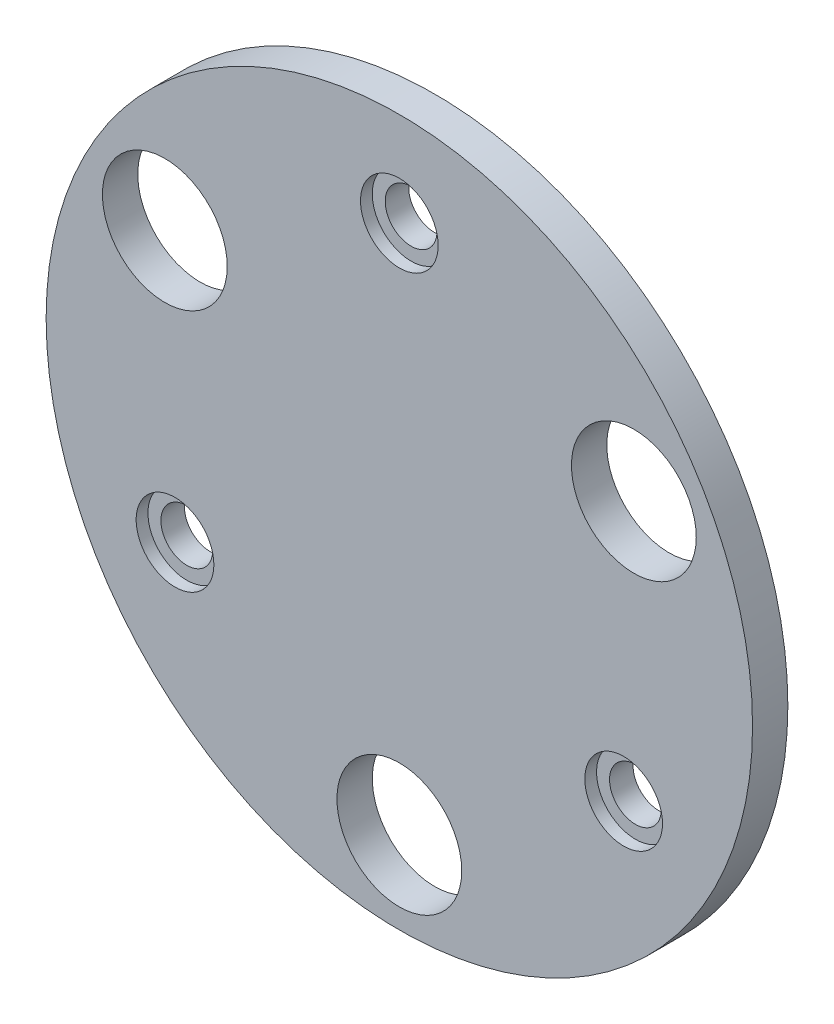
ISO-10303-21;
HEADER;
FILE_DESCRIPTION(('STEP AP214'),'2;1');
FILE_NAME('part.step','',(''),(''),'','','');
FILE_SCHEMA(('AUTOMOTIVE_DESIGN { 1 0 10303 214 1 1 1 1 }'));
ENDSEC;
DATA;
#1=APPLICATION_CONTEXT('core data for automotive mechanical design processes');
#2=APPLICATION_PROTOCOL_DEFINITION('international standard','automotive_design',2000,#1);
#3=PRODUCT_CONTEXT('',#1,'mechanical');
#4=PRODUCT('Part','Part','',(#3));
#5=PRODUCT_RELATED_PRODUCT_CATEGORY('part','',(#4));
#6=PRODUCT_DEFINITION_FORMATION('','',#4);
#7=PRODUCT_DEFINITION_CONTEXT('part definition',#1,'design');
#8=PRODUCT_DEFINITION('design','',#6,#7);
#9=PRODUCT_DEFINITION_SHAPE('','',#8);
#10=(LENGTH_UNIT() NAMED_UNIT(*) SI_UNIT(.MILLI.,.METRE.));
#11=(NAMED_UNIT(*) PLANE_ANGLE_UNIT() SI_UNIT($,.RADIAN.));
#12=(NAMED_UNIT(*) SI_UNIT($,.STERADIAN.) SOLID_ANGLE_UNIT());
#13=UNCERTAINTY_MEASURE_WITH_UNIT(LENGTH_MEASURE(1.E-05),#10,'distance_accuracy_value','');
#14=(GEOMETRIC_REPRESENTATION_CONTEXT(3) GLOBAL_UNCERTAINTY_ASSIGNED_CONTEXT((#13)) GLOBAL_UNIT_ASSIGNED_CONTEXT((#10,
#11,#12)) REPRESENTATION_CONTEXT('',''));
#15=CARTESIAN_POINT('',(0.,0.,0.));
#16=DIRECTION('',(0.,0.,1.));
#17=DIRECTION('',(1.,0.,0.));
#18=AXIS2_PLACEMENT_3D('',#15,#16,#17);
#19=CARTESIAN_POINT('',(0.,11.,1.5));
#20=DIRECTION('',(0.,0.,-1.));
#21=DIRECTION('',(-1.,0.,0.));
#22=AXIS2_PLACEMENT_3D('',#19,#20,#21);
#23=CYLINDRICAL_SURFACE('',#22,1.1);
#24=CARTESIAN_POINT('',(0.,11.,0.));
#25=DIRECTION('',(0.,0.,1.));
#26=DIRECTION('',(1.,0.,0.));
#27=AXIS2_PLACEMENT_3D('',#24,#25,#26);
#28=CIRCLE('',#27,1.1);
#29=CARTESIAN_POINT('',(1.1,11.,0.));
#30=VERTEX_POINT('',#29);
#31=EDGE_CURVE('E96',#30,#30,#28,.T.);
#32=ORIENTED_EDGE('',*,*,#31,.F.);
#33=EDGE_LOOP('',(#32));
#34=FACE_BOUND('',#33,.T.);
#35=CARTESIAN_POINT('',(0.,11.,1.));
#36=DIRECTION('',(0.,0.,1.));
#37=DIRECTION('',(1.,0.,0.));
#38=AXIS2_PLACEMENT_3D('',#35,#36,#37);
#39=CIRCLE('',#38,1.1);
#40=CARTESIAN_POINT('',(1.1,11.,1.));
#41=VERTEX_POINT('',#40);
#42=EDGE_CURVE('E122',#41,#41,#39,.T.);
#43=ORIENTED_EDGE('',*,*,#42,.T.);
#44=EDGE_LOOP('',(#43));
#45=FACE_BOUND('',#44,.T.);
#46=ADVANCED_FACE('F57',(#34,#45),#23,.F.);
#47=CARTESIAN_POINT('',(-9.52627944162883,-5.5,1.5));
#48=DIRECTION('',(0.,0.,-1.));
#49=DIRECTION('',(-1.,0.,0.));
#50=AXIS2_PLACEMENT_3D('',#47,#48,#49);
#51=CYLINDRICAL_SURFACE('',#50,1.1);
#52=CARTESIAN_POINT('',(-9.52627944162883,-5.5,0.));
#53=DIRECTION('',(0.,0.,1.));
#54=DIRECTION('',(1.,0.,0.));
#55=AXIS2_PLACEMENT_3D('',#52,#53,#54);
#56=CIRCLE('',#55,1.1);
#57=CARTESIAN_POINT('',(-8.42627944162883,-5.5,0.));
#58=VERTEX_POINT('',#57);
#59=EDGE_CURVE('E76',#58,#58,#56,.T.);
#60=ORIENTED_EDGE('',*,*,#59,.F.);
#61=EDGE_LOOP('',(#60));
#62=FACE_BOUND('',#61,.T.);
#63=CARTESIAN_POINT('',(-9.52627944162883,-5.5,1.));
#64=DIRECTION('',(0.,0.,1.));
#65=DIRECTION('',(1.,0.,0.));
#66=AXIS2_PLACEMENT_3D('',#63,#64,#65);
#67=CIRCLE('',#66,1.1);
#68=CARTESIAN_POINT('',(-8.42627944162883,-5.5,1.));
#69=VERTEX_POINT('',#68);
#70=EDGE_CURVE('E126',#69,#69,#67,.T.);
#71=ORIENTED_EDGE('',*,*,#70,.T.);
#72=EDGE_LOOP('',(#71));
#73=FACE_BOUND('',#72,.T.);
#74=ADVANCED_FACE('F59',(#62,#73),#51,.F.);
#75=CARTESIAN_POINT('',(9.52627944162883,-5.5,1.5));
#76=DIRECTION('',(0.,0.,-1.));
#77=DIRECTION('',(-1.,0.,0.));
#78=AXIS2_PLACEMENT_3D('',#75,#76,#77);
#79=CYLINDRICAL_SURFACE('',#78,1.1);
#80=CARTESIAN_POINT('',(9.52627944162883,-5.5,0.));
#81=DIRECTION('',(0.,0.,1.));
#82=DIRECTION('',(1.,0.,0.));
#83=AXIS2_PLACEMENT_3D('',#80,#81,#82);
#84=CIRCLE('',#83,1.1);
#85=CARTESIAN_POINT('',(10.6262794416288,-5.5,0.));
#86=VERTEX_POINT('',#85);
#87=EDGE_CURVE('E99',#86,#86,#84,.T.);
#88=ORIENTED_EDGE('',*,*,#87,.F.);
#89=EDGE_LOOP('',(#88));
#90=FACE_BOUND('',#89,.T.);
#91=CARTESIAN_POINT('',(9.52627944162883,-5.5,1.));
#92=DIRECTION('',(0.,0.,1.));
#93=DIRECTION('',(1.,0.,0.));
#94=AXIS2_PLACEMENT_3D('',#91,#92,#93);
#95=CIRCLE('',#94,1.1);
#96=CARTESIAN_POINT('',(10.6262794416288,-5.5,1.));
#97=VERTEX_POINT('',#96);
#98=EDGE_CURVE('E61',#97,#97,#95,.T.);
#99=ORIENTED_EDGE('',*,*,#98,.T.);
#100=EDGE_LOOP('',(#99));
#101=FACE_BOUND('',#100,.T.);
#102=ADVANCED_FACE('F216',(#90,#101),#79,.F.);
#103=CARTESIAN_POINT('',(0.,0.,1.5));
#104=DIRECTION('',(0.,0.,-1.));
#105=DIRECTION('',(-1.,0.,0.));
#106=AXIS2_PLACEMENT_3D('',#103,#104,#105);
#107=CYLINDRICAL_SURFACE('',#106,15.);
#108=CARTESIAN_POINT('',(0.,0.,1.5));
#109=DIRECTION('',(0.,0.,1.));
#110=DIRECTION('',(1.,0.,0.));
#111=AXIS2_PLACEMENT_3D('',#108,#109,#110);
#112=CIRCLE('',#111,15.);
#113=CARTESIAN_POINT('',(15.,0.,1.5));
#114=VERTEX_POINT('',#113);
#115=EDGE_CURVE('E11',#114,#114,#112,.T.);
#116=ORIENTED_EDGE('',*,*,#115,.F.);
#117=EDGE_LOOP('',(#116));
#118=FACE_BOUND('',#117,.T.);
#119=CARTESIAN_POINT('',(0.,0.,0.));
#120=DIRECTION('',(0.,0.,1.));
#121=DIRECTION('',(1.,0.,0.));
#122=AXIS2_PLACEMENT_3D('',#119,#120,#121);
#123=CIRCLE('',#122,15.);
#124=CARTESIAN_POINT('',(15.,0.,0.));
#125=VERTEX_POINT('',#124);
#126=EDGE_CURVE('E92',#125,#125,#123,.T.);
#127=ORIENTED_EDGE('',*,*,#126,.T.);
#128=EDGE_LOOP('',(#127));
#129=FACE_BOUND('',#128,.T.);
#130=ADVANCED_FACE('F179',(#118,#129),#107,.T.);
#131=CARTESIAN_POINT('',(9.95929214352106,5.74999999999998,1.5));
#132=DIRECTION('',(0.,0.,-1.));
#133=DIRECTION('',(-1.,0.,0.));
#134=AXIS2_PLACEMENT_3D('',#131,#132,#133);
#135=CYLINDRICAL_SURFACE('',#134,2.65);
#136=CARTESIAN_POINT('',(9.95929214352106,5.74999999999998,1.5));
#137=DIRECTION('',(0.,0.,1.));
#138=DIRECTION('',(1.,0.,0.));
#139=AXIS2_PLACEMENT_3D('',#136,#137,#138);
#140=CIRCLE('',#139,2.65);
#141=CARTESIAN_POINT('',(12.6092921435211,5.74999999999998,1.5));
#142=VERTEX_POINT('',#141);
#143=EDGE_CURVE('E66',#142,#142,#140,.T.);
#144=ORIENTED_EDGE('',*,*,#143,.T.);
#145=EDGE_LOOP('',(#144));
#146=FACE_BOUND('',#145,.T.);
#147=CARTESIAN_POINT('',(9.95929214352106,5.74999999999998,0.));
#148=DIRECTION('',(0.,0.,1.));
#149=DIRECTION('',(1.,0.,0.));
#150=AXIS2_PLACEMENT_3D('',#147,#148,#149);
#151=CIRCLE('',#150,2.65);
#152=CARTESIAN_POINT('',(12.6092921435211,5.74999999999998,0.));
#153=VERTEX_POINT('',#152);
#154=EDGE_CURVE('E88',#153,#153,#151,.T.);
#155=ORIENTED_EDGE('',*,*,#154,.F.);
#156=EDGE_LOOP('',(#155));
#157=FACE_BOUND('',#156,.T.);
#158=ADVANCED_FACE('F175',(#146,#157),#135,.F.);
#159=CARTESIAN_POINT('',(0.,-11.5,1.5));
#160=DIRECTION('',(0.,0.,-1.));
#161=DIRECTION('',(-1.,0.,0.));
#162=AXIS2_PLACEMENT_3D('',#159,#160,#161);
#163=CYLINDRICAL_SURFACE('',#162,2.65);
#164=CARTESIAN_POINT('',(0.,-11.5,1.5));
#165=DIRECTION('',(0.,0.,1.));
#166=DIRECTION('',(1.,0.,0.));
#167=AXIS2_PLACEMENT_3D('',#164,#165,#166);
#168=CIRCLE('',#167,2.65);
#169=CARTESIAN_POINT('',(2.64999999999998,-11.5,1.5));
#170=VERTEX_POINT('',#169);
#171=EDGE_CURVE('E72',#170,#170,#168,.T.);
#172=ORIENTED_EDGE('',*,*,#171,.T.);
#173=EDGE_LOOP('',(#172));
#174=FACE_BOUND('',#173,.T.);
#175=CARTESIAN_POINT('',(0.,-11.5,0.));
#176=DIRECTION('',(0.,0.,1.));
#177=DIRECTION('',(1.,0.,0.));
#178=AXIS2_PLACEMENT_3D('',#175,#176,#177);
#179=CIRCLE('',#178,2.65);
#180=CARTESIAN_POINT('',(2.64999999999998,-11.5,0.));
#181=VERTEX_POINT('',#180);
#182=EDGE_CURVE('E84',#181,#181,#179,.T.);
#183=ORIENTED_EDGE('',*,*,#182,.F.);
#184=EDGE_LOOP('',(#183));
#185=FACE_BOUND('',#184,.T.);
#186=ADVANCED_FACE('F178',(#174,#185),#163,.F.);
#187=CARTESIAN_POINT('',(-9.95929214352103,5.75000000000002,1.5));
#188=DIRECTION('',(0.,0.,-1.));
#189=DIRECTION('',(-1.,0.,0.));
#190=AXIS2_PLACEMENT_3D('',#187,#188,#189);
#191=CYLINDRICAL_SURFACE('',#190,2.65);
#192=CARTESIAN_POINT('',(-9.95929214352103,5.75000000000002,1.5));
#193=DIRECTION('',(0.,0.,1.));
#194=DIRECTION('',(1.,0.,0.));
#195=AXIS2_PLACEMENT_3D('',#192,#193,#194);
#196=CIRCLE('',#195,2.65);
#197=CARTESIAN_POINT('',(-7.30929214352103,5.75000000000002,1.5));
#198=VERTEX_POINT('',#197);
#199=EDGE_CURVE('E102',#198,#198,#196,.T.);
#200=ORIENTED_EDGE('',*,*,#199,.T.);
#201=EDGE_LOOP('',(#200));
#202=FACE_BOUND('',#201,.T.);
#203=CARTESIAN_POINT('',(-9.95929214352103,5.75000000000002,0.));
#204=DIRECTION('',(0.,0.,1.));
#205=DIRECTION('',(1.,0.,0.));
#206=AXIS2_PLACEMENT_3D('',#203,#204,#205);
#207=CIRCLE('',#206,2.65);
#208=CARTESIAN_POINT('',(-7.30929214352103,5.75000000000002,0.));
#209=VERTEX_POINT('',#208);
#210=EDGE_CURVE('E80',#209,#209,#207,.T.);
#211=ORIENTED_EDGE('',*,*,#210,.F.);
#212=EDGE_LOOP('',(#211));
#213=FACE_BOUND('',#212,.T.);
#214=ADVANCED_FACE('F164',(#202,#213),#191,.F.);
#215=CARTESIAN_POINT('',(0.,0.,1.5));
#216=DIRECTION('',(0.,0.,1.));
#217=DIRECTION('',(1.,0.,0.));
#218=AXIS2_PLACEMENT_3D('',#215,#216,#217);
#219=PLANE('',#218);
#220=CARTESIAN_POINT('',(-9.52627944162883,-5.5,1.5));
#221=DIRECTION('',(0.,0.,1.));
#222=DIRECTION('',(1.,0.,0.));
#223=AXIS2_PLACEMENT_3D('',#220,#221,#222);
#224=CIRCLE('',#223,1.65000000000009);
#225=CARTESIAN_POINT('',(-7.87627944162873,-5.5,1.5));
#226=VERTEX_POINT('',#225);
#227=EDGE_CURVE('E134',#226,#226,#224,.T.);
#228=ORIENTED_EDGE('',*,*,#227,.F.);
#229=EDGE_LOOP('',(#228));
#230=FACE_BOUND('',#229,.T.);
#231=CARTESIAN_POINT('',(0.,11.,1.5));
#232=DIRECTION('',(0.,0.,1.));
#233=DIRECTION('',(1.,0.,0.));
#234=AXIS2_PLACEMENT_3D('',#231,#232,#233);
#235=CIRCLE('',#234,1.65);
#236=CARTESIAN_POINT('',(1.65,11.,1.5));
#237=VERTEX_POINT('',#236);
#238=EDGE_CURVE('E127',#237,#237,#235,.T.);
#239=ORIENTED_EDGE('',*,*,#238,.F.);
#240=EDGE_LOOP('',(#239));
#241=FACE_BOUND('',#240,.T.);
#242=CARTESIAN_POINT('',(9.52627944162883,-5.5,1.5));
#243=DIRECTION('',(0.,0.,1.));
#244=DIRECTION('',(1.,0.,0.));
#245=AXIS2_PLACEMENT_3D('',#242,#243,#244);
#246=CIRCLE('',#245,1.65000000000005);
#247=CARTESIAN_POINT('',(11.1762794416289,-5.5,1.5));
#248=VERTEX_POINT('',#247);
#249=EDGE_CURVE('E117',#248,#248,#246,.T.);
#250=ORIENTED_EDGE('',*,*,#249,.F.);
#251=EDGE_LOOP('',(#250));
#252=FACE_BOUND('',#251,.T.);
#253=ORIENTED_EDGE('',*,*,#199,.F.);
#254=EDGE_LOOP('',(#253));
#255=FACE_BOUND('',#254,.T.);
#256=ORIENTED_EDGE('',*,*,#171,.F.);
#257=EDGE_LOOP('',(#256));
#258=FACE_BOUND('',#257,.T.);
#259=ORIENTED_EDGE('',*,*,#143,.F.);
#260=EDGE_LOOP('',(#259));
#261=FACE_BOUND('',#260,.T.);
#262=ORIENTED_EDGE('',*,*,#115,.T.);
#263=EDGE_LOOP('',(#262));
#264=FACE_BOUND('',#263,.T.);
#265=ADVANCED_FACE('F160',(#230,#241,#252,#255,#258,#261,#264),#219,.T.);
#266=CARTESIAN_POINT('',(0.,0.,0.));
#267=DIRECTION('',(0.,0.,1.));
#268=DIRECTION('',(1.,0.,0.));
#269=AXIS2_PLACEMENT_3D('',#266,#267,#268);
#270=PLANE('',#269);
#271=ORIENTED_EDGE('',*,*,#59,.T.);
#272=EDGE_LOOP('',(#271));
#273=FACE_BOUND('',#272,.T.);
#274=ORIENTED_EDGE('',*,*,#210,.T.);
#275=EDGE_LOOP('',(#274));
#276=FACE_BOUND('',#275,.T.);
#277=ORIENTED_EDGE('',*,*,#182,.T.);
#278=EDGE_LOOP('',(#277));
#279=FACE_BOUND('',#278,.T.);
#280=ORIENTED_EDGE('',*,*,#154,.T.);
#281=EDGE_LOOP('',(#280));
#282=FACE_BOUND('',#281,.T.);
#283=ORIENTED_EDGE('',*,*,#126,.F.);
#284=EDGE_LOOP('',(#283));
#285=FACE_BOUND('',#284,.T.);
#286=ORIENTED_EDGE('',*,*,#31,.T.);
#287=EDGE_LOOP('',(#286));
#288=FACE_BOUND('',#287,.T.);
#289=ORIENTED_EDGE('',*,*,#87,.T.);
#290=EDGE_LOOP('',(#289));
#291=FACE_BOUND('',#290,.T.);
#292=ADVANCED_FACE('F163',(#273,#276,#279,#282,#285,#288,#291),#270,.F.);
#293=CARTESIAN_POINT('',(9.52627944162883,-5.5,1.));
#294=DIRECTION('',(0.,0.,1.));
#295=DIRECTION('',(1.,0.,0.));
#296=AXIS2_PLACEMENT_3D('',#293,#294,#295);
#297=CYLINDRICAL_SURFACE('',#296,1.65000000000005);
#298=CARTESIAN_POINT('',(9.52627944162883,-5.5,1.));
#299=DIRECTION('',(0.,0.,1.));
#300=DIRECTION('',(1.,0.,0.));
#301=AXIS2_PLACEMENT_3D('',#298,#299,#300);
#302=CIRCLE('',#301,1.65000000000005);
#303=CARTESIAN_POINT('',(11.1762794416289,-5.5,1.));
#304=VERTEX_POINT('',#303);
#305=EDGE_CURVE('E113',#304,#304,#302,.T.);
#306=ORIENTED_EDGE('',*,*,#305,.F.);
#307=EDGE_LOOP('',(#306));
#308=FACE_BOUND('',#307,.T.);
#309=ORIENTED_EDGE('',*,*,#249,.T.);
#310=EDGE_LOOP('',(#309));
#311=FACE_BOUND('',#310,.T.);
#312=ADVANCED_FACE('F185',(#308,#311),#297,.F.);
#313=CARTESIAN_POINT('',(9.52627944162883,-5.5,1.));
#314=DIRECTION('',(0.,0.,1.));
#315=DIRECTION('',(1.,0.,0.));
#316=AXIS2_PLACEMENT_3D('',#313,#314,#315);
#317=PLANE('',#316);
#318=ORIENTED_EDGE('',*,*,#98,.F.);
#319=EDGE_LOOP('',(#318));
#320=FACE_BOUND('',#319,.T.);
#321=ORIENTED_EDGE('',*,*,#305,.T.);
#322=EDGE_LOOP('',(#321));
#323=FACE_BOUND('',#322,.T.);
#324=ADVANCED_FACE('F205',(#320,#323),#317,.T.);
#325=CARTESIAN_POINT('',(0.,11.,1.));
#326=DIRECTION('',(0.,0.,1.));
#327=DIRECTION('',(1.,0.,0.));
#328=AXIS2_PLACEMENT_3D('',#325,#326,#327);
#329=CYLINDRICAL_SURFACE('',#328,1.65);
#330=CARTESIAN_POINT('',(0.,11.,1.));
#331=DIRECTION('',(0.,0.,1.));
#332=DIRECTION('',(1.,0.,0.));
#333=AXIS2_PLACEMENT_3D('',#330,#331,#332);
#334=CIRCLE('',#333,1.65);
#335=CARTESIAN_POINT('',(1.65,11.,1.));
#336=VERTEX_POINT('',#335);
#337=EDGE_CURVE('E121',#336,#336,#334,.T.);
#338=ORIENTED_EDGE('',*,*,#337,.F.);
#339=EDGE_LOOP('',(#338));
#340=FACE_BOUND('',#339,.T.);
#341=ORIENTED_EDGE('',*,*,#238,.T.);
#342=EDGE_LOOP('',(#341));
#343=FACE_BOUND('',#342,.T.);
#344=ADVANCED_FACE('F199',(#340,#343),#329,.F.);
#345=CARTESIAN_POINT('',(0.,11.,1.));
#346=DIRECTION('',(0.,0.,1.));
#347=DIRECTION('',(1.,0.,0.));
#348=AXIS2_PLACEMENT_3D('',#345,#346,#347);
#349=PLANE('',#348);
#350=ORIENTED_EDGE('',*,*,#42,.F.);
#351=EDGE_LOOP('',(#350));
#352=FACE_BOUND('',#351,.T.);
#353=ORIENTED_EDGE('',*,*,#337,.T.);
#354=EDGE_LOOP('',(#353));
#355=FACE_BOUND('',#354,.T.);
#356=ADVANCED_FACE('F156',(#352,#355),#349,.T.);
#357=CARTESIAN_POINT('',(-9.52627944162883,-5.5,1.));
#358=DIRECTION('',(0.,0.,1.));
#359=DIRECTION('',(1.,0.,0.));
#360=AXIS2_PLACEMENT_3D('',#357,#358,#359);
#361=CYLINDRICAL_SURFACE('',#360,1.65000000000009);
#362=CARTESIAN_POINT('',(-9.52627944162883,-5.5,1.));
#363=DIRECTION('',(0.,0.,1.));
#364=DIRECTION('',(1.,0.,0.));
#365=AXIS2_PLACEMENT_3D('',#362,#363,#364);
#366=CIRCLE('',#365,1.65000000000009);
#367=CARTESIAN_POINT('',(-7.87627944162873,-5.5,1.));
#368=VERTEX_POINT('',#367);
#369=EDGE_CURVE('E138',#368,#368,#366,.T.);
#370=ORIENTED_EDGE('',*,*,#369,.F.);
#371=EDGE_LOOP('',(#370));
#372=FACE_BOUND('',#371,.T.);
#373=ORIENTED_EDGE('',*,*,#227,.T.);
#374=EDGE_LOOP('',(#373));
#375=FACE_BOUND('',#374,.T.);
#376=ADVANCED_FACE('F150',(#372,#375),#361,.F.);
#377=CARTESIAN_POINT('',(-9.52627944162883,-5.5,1.));
#378=DIRECTION('',(0.,0.,1.));
#379=DIRECTION('',(1.,0.,0.));
#380=AXIS2_PLACEMENT_3D('',#377,#378,#379);
#381=PLANE('',#380);
#382=ORIENTED_EDGE('',*,*,#70,.F.);
#383=EDGE_LOOP('',(#382));
#384=FACE_BOUND('',#383,.T.);
#385=ORIENTED_EDGE('',*,*,#369,.T.);
#386=EDGE_LOOP('',(#385));
#387=FACE_BOUND('',#386,.T.);
#388=ADVANCED_FACE('F147',(#384,#387),#381,.T.);
#389=CLOSED_SHELL('',(#46,#74,#102,#130,#158,#186,#214,#265,#292,#312,#324,#344,#356,#376,#388));
#390=MANIFOLD_SOLID_BREP('B2',#389);
#391=ADVANCED_BREP_SHAPE_REPRESENTATION('',(#18,#390),#14);
#392=SHAPE_DEFINITION_REPRESENTATION(#9,#391);
ENDSEC;
END-ISO-10303-21;
